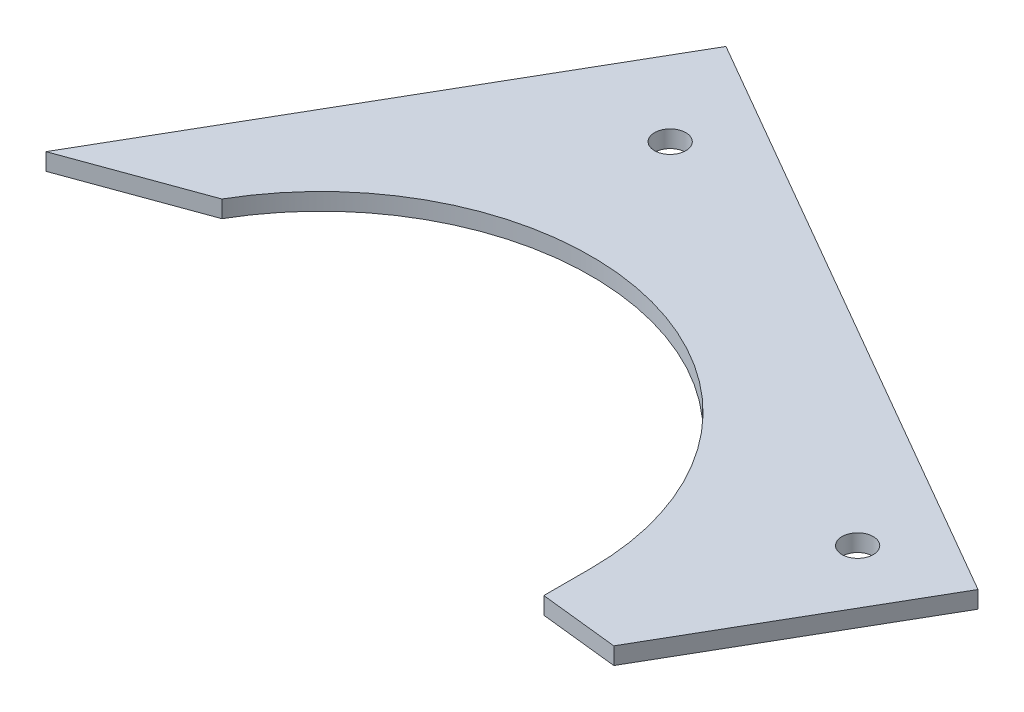
ISO-10303-21;
HEADER;
FILE_DESCRIPTION(('STEP AP214'),'2;1');
FILE_NAME('part.step','',(''),(''),'','','');
FILE_SCHEMA(('AUTOMOTIVE_DESIGN { 1 0 10303 214 1 1 1 1 }'));
ENDSEC;
DATA;
#1=APPLICATION_CONTEXT('core data for automotive mechanical design processes');
#2=APPLICATION_PROTOCOL_DEFINITION('international standard','automotive_design',2000,#1);
#3=PRODUCT_CONTEXT('',#1,'mechanical');
#4=PRODUCT('Part','Part','',(#3));
#5=PRODUCT_RELATED_PRODUCT_CATEGORY('part','',(#4));
#6=PRODUCT_DEFINITION_FORMATION('','',#4);
#7=PRODUCT_DEFINITION_CONTEXT('part definition',#1,'design');
#8=PRODUCT_DEFINITION('design','',#6,#7);
#9=PRODUCT_DEFINITION_SHAPE('','',#8);
#10=(LENGTH_UNIT() NAMED_UNIT(*) SI_UNIT(.MILLI.,.METRE.));
#11=(NAMED_UNIT(*) PLANE_ANGLE_UNIT() SI_UNIT($,.RADIAN.));
#12=(NAMED_UNIT(*) SI_UNIT($,.STERADIAN.) SOLID_ANGLE_UNIT());
#13=UNCERTAINTY_MEASURE_WITH_UNIT(LENGTH_MEASURE(1.E-05),#10,'distance_accuracy_value','');
#14=(GEOMETRIC_REPRESENTATION_CONTEXT(3) GLOBAL_UNCERTAINTY_ASSIGNED_CONTEXT((#13)) GLOBAL_UNIT_ASSIGNED_CONTEXT((#10,
#11,#12)) REPRESENTATION_CONTEXT('',''));
#15=CARTESIAN_POINT('',(0.,0.,0.));
#16=DIRECTION('',(0.,0.,1.));
#17=DIRECTION('',(1.,0.,0.));
#18=AXIS2_PLACEMENT_3D('',#15,#16,#17);
#19=CARTESIAN_POINT('',(-75.0000011175871,2.5,0.));
#20=DIRECTION('',(0.,1.,0.));
#21=DIRECTION('',(0.,0.,1.));
#22=AXIS2_PLACEMENT_3D('',#19,#20,#21);
#23=PLANE('',#22);
#24=CARTESIAN_POINT('',(-85.4711431702986,2.5,-71.863448015713));
#25=DIRECTION('',(0.,1.,0.));
#26=DIRECTION('',(0.,0.,1.));
#27=AXIS2_PLACEMENT_3D('',#24,#25,#26);
#28=CIRCLE('',#27,2.74999999999994);
#29=CARTESIAN_POINT('',(-85.4711431702986,2.5,-69.113448015713));
#30=VERTEX_POINT('',#29);
#31=EDGE_CURVE('E127',#30,#30,#28,.T.);
#32=ORIENTED_EDGE('',*,*,#31,.F.);
#33=EDGE_LOOP('',(#32));
#34=FACE_BOUND('',#33,.T.);
#35=DIRECTION('',(0.994060876940802,0.,0.108825424123615));
#36=VECTOR('',#35,1.);
#37=CARTESIAN_POINT('',(-27.5000011175871,2.5,8.31100029147373));
#38=LINE('',#37,#36);
#39=CARTESIAN_POINT('',(-27.5000011175871,2.5,8.31100029147373));
#40=VERTEX_POINT('',#39);
#41=CARTESIAN_POINT('',(-13.6980844911307,2.5,9.82197357835657));
#42=VERTEX_POINT('',#41);
#43=EDGE_CURVE('E136',#40,#42,#38,.T.);
#44=ORIENTED_EDGE('',*,*,#43,.T.);
#45=DIRECTION('',(0.5,0.,-0.866025403784439));
#46=VECTOR('',#45,1.);
#47=CARTESIAN_POINT('',(-13.6980844911307,2.5,9.82197357835657));
#48=LINE('',#47,#46);
#49=CARTESIAN_POINT('',(9.7294759487304,2.5,-30.7557514008736));
#50=VERTEX_POINT('',#49);
#51=EDGE_CURVE('E89',#42,#50,#48,.T.);
#52=ORIENTED_EDGE('',*,*,#51,.T.);
#53=DIRECTION('',(-0.866025403784439,0.,-0.5));
#54=VECTOR('',#53,1.);
#55=CARTESIAN_POINT('',(9.7294759487304,2.5,-30.7557514008736));
#56=LINE('',#55,#54);
#57=CARTESIAN_POINT('',(-95.0596007548729,2.5,-91.2557530438312));
#58=VERTEX_POINT('',#57);
#59=EDGE_CURVE('E148',#50,#58,#56,.T.);
#60=ORIENTED_EDGE('',*,*,#59,.T.);
#61=DIRECTION('',(-0.500000007561395,0.,0.866025399418865));
#62=VECTOR('',#61,1.);
#63=CARTESIAN_POINT('',(-138.795691763255,2.5,-15.5026228203214));
#64=LINE('',#63,#62);
#65=CARTESIAN_POINT('',(-138.795691763255,2.5,-15.5026228203214));
#66=VERTEX_POINT('',#65);
#67=EDGE_CURVE('E105',#58,#66,#64,.T.);
#68=ORIENTED_EDGE('',*,*,#67,.T.);
#69=DIRECTION('',(0.939692623772137,0.,-0.342020135121072));
#70=VECTOR('',#69,1.);
#71=CARTESIAN_POINT('',(-138.795691763255,2.5,-15.5026228203214));
#72=LINE('',#71,#70);
#73=CARTESIAN_POINT('',(-116.136207589983,2.5,-23.750000359166));
#74=VERTEX_POINT('',#73);
#75=EDGE_CURVE('E99',#66,#74,#72,.T.);
#76=ORIENTED_EDGE('',*,*,#75,.T.);
#77=CARTESIAN_POINT('',(-75.0000011175871,2.5,0.));
#78=DIRECTION('',(0.,-1.,0.));
#79=DIRECTION('',(0.,0.,1.));
#80=AXIS2_PLACEMENT_3D('',#77,#78,#79);
#81=CIRCLE('',#80,47.5);
#82=CARTESIAN_POINT('',(-27.5000011175871,2.5,0.));
#83=VERTEX_POINT('',#82);
#84=EDGE_CURVE('E103',#74,#83,#81,.T.);
#85=ORIENTED_EDGE('',*,*,#84,.T.);
#86=DIRECTION('',(0.,0.,1.));
#87=VECTOR('',#86,1.);
#88=CARTESIAN_POINT('',(-27.5000011175871,2.5,8.31100029147373));
#89=LINE('',#88,#87);
#90=EDGE_CURVE('E49',#83,#40,#89,.T.);
#91=ORIENTED_EDGE('',*,*,#90,.T.);
#92=EDGE_LOOP('',(#44,#52,#60,#68,#76,#85,#91));
#93=FACE_BOUND('',#92,.T.);
#94=CARTESIAN_POINT('',(-7.52885682969917,2.5,-26.863448015713));
#95=DIRECTION('',(0.,1.,0.));
#96=DIRECTION('',(0.,0.,1.));
#97=AXIS2_PLACEMENT_3D('',#94,#95,#96);
#98=CIRCLE('',#97,2.75000000000001);
#99=CARTESIAN_POINT('',(-7.52885682969917,2.5,-24.113448015713));
#100=VERTEX_POINT('',#99);
#101=EDGE_CURVE('E163',#100,#100,#98,.T.);
#102=ORIENTED_EDGE('',*,*,#101,.F.);
#103=EDGE_LOOP('',(#102));
#104=FACE_BOUND('',#103,.T.);
#105=ADVANCED_FACE('F32',(#34,#93,#104),#23,.T.);
#106=CARTESIAN_POINT('',(-75.0000011175871,-0.5,0.));
#107=DIRECTION('',(0.,1.,0.));
#108=DIRECTION('',(0.,0.,1.));
#109=AXIS2_PLACEMENT_3D('',#106,#107,#108);
#110=PLANE('',#109);
#111=DIRECTION('',(0.994060876940802,0.,0.108825424123615));
#112=VECTOR('',#111,1.);
#113=CARTESIAN_POINT('',(-27.5000011175871,-0.5,8.31100029147373));
#114=LINE('',#113,#112);
#115=CARTESIAN_POINT('',(-27.5000011175871,-0.5,8.31100029147373));
#116=VERTEX_POINT('',#115);
#117=CARTESIAN_POINT('',(-13.6980844911307,-0.5,9.82197357835657));
#118=VERTEX_POINT('',#117);
#119=EDGE_CURVE('E123',#116,#118,#114,.T.);
#120=ORIENTED_EDGE('',*,*,#119,.F.);
#121=DIRECTION('',(0.,0.,1.));
#122=VECTOR('',#121,1.);
#123=CARTESIAN_POINT('',(-27.5000011175871,-0.5,8.31100029147373));
#124=LINE('',#123,#122);
#125=CARTESIAN_POINT('',(-27.5000011175871,-0.5,0.));
#126=VERTEX_POINT('',#125);
#127=EDGE_CURVE('E81',#126,#116,#124,.T.);
#128=ORIENTED_EDGE('',*,*,#127,.F.);
#129=CARTESIAN_POINT('',(-75.0000011175871,-0.5,0.));
#130=DIRECTION('',(0.,-1.,0.));
#131=DIRECTION('',(0.,0.,1.));
#132=AXIS2_PLACEMENT_3D('',#129,#130,#131);
#133=CIRCLE('',#132,47.5);
#134=CARTESIAN_POINT('',(-116.136207589983,-0.5,-23.750000359166));
#135=VERTEX_POINT('',#134);
#136=EDGE_CURVE('E75',#135,#126,#133,.T.);
#137=ORIENTED_EDGE('',*,*,#136,.F.);
#138=DIRECTION('',(0.939692623772137,0.,-0.342020135121072));
#139=VECTOR('',#138,1.);
#140=CARTESIAN_POINT('',(-138.795691763255,-0.5,-15.5026228203214));
#141=LINE('',#140,#139);
#142=CARTESIAN_POINT('',(-138.795691763255,-0.5,-15.5026228203214));
#143=VERTEX_POINT('',#142);
#144=EDGE_CURVE('E113',#143,#135,#141,.T.);
#145=ORIENTED_EDGE('',*,*,#144,.F.);
#146=DIRECTION('',(-0.500000007561395,0.,0.866025399418865));
#147=VECTOR('',#146,1.);
#148=CARTESIAN_POINT('',(-138.795691763255,-0.5,-15.5026228203214));
#149=LINE('',#148,#147);
#150=CARTESIAN_POINT('',(-95.0596007548729,-0.5,-91.2557530438312));
#151=VERTEX_POINT('',#150);
#152=EDGE_CURVE('E131',#151,#143,#149,.T.);
#153=ORIENTED_EDGE('',*,*,#152,.F.);
#154=DIRECTION('',(-0.866025403784439,0.,-0.5));
#155=VECTOR('',#154,1.);
#156=CARTESIAN_POINT('',(9.7294759487304,-0.5,-30.7557514008736));
#157=LINE('',#156,#155);
#158=CARTESIAN_POINT('',(9.7294759487304,-0.5,-30.7557514008736));
#159=VERTEX_POINT('',#158);
#160=EDGE_CURVE('E129',#159,#151,#157,.T.);
#161=ORIENTED_EDGE('',*,*,#160,.F.);
#162=DIRECTION('',(0.5,0.,-0.866025403784439));
#163=VECTOR('',#162,1.);
#164=CARTESIAN_POINT('',(-13.6980844911307,-0.5,9.82197357835657));
#165=LINE('',#164,#163);
#166=EDGE_CURVE('E126',#118,#159,#165,.T.);
#167=ORIENTED_EDGE('',*,*,#166,.F.);
#168=EDGE_LOOP('',(#120,#128,#137,#145,#153,#161,#167));
#169=FACE_BOUND('',#168,.T.);
#170=CARTESIAN_POINT('',(-85.4711431702986,-0.5,-71.863448015713));
#171=DIRECTION('',(0.,1.,0.));
#172=DIRECTION('',(0.,0.,1.));
#173=AXIS2_PLACEMENT_3D('',#170,#171,#172);
#174=CIRCLE('',#173,2.74999999999994);
#175=CARTESIAN_POINT('',(-85.4711431702986,-0.5,-69.113448015713));
#176=VERTEX_POINT('',#175);
#177=EDGE_CURVE('E160',#176,#176,#174,.T.);
#178=ORIENTED_EDGE('',*,*,#177,.T.);
#179=EDGE_LOOP('',(#178));
#180=FACE_BOUND('',#179,.T.);
#181=CARTESIAN_POINT('',(-7.52885682969917,-0.5,-26.863448015713));
#182=DIRECTION('',(0.,1.,0.));
#183=DIRECTION('',(0.,0.,1.));
#184=AXIS2_PLACEMENT_3D('',#181,#182,#183);
#185=CIRCLE('',#184,2.75000000000001);
#186=CARTESIAN_POINT('',(-7.52885682969917,-0.5,-24.113448015713));
#187=VERTEX_POINT('',#186);
#188=EDGE_CURVE('E166',#187,#187,#185,.T.);
#189=ORIENTED_EDGE('',*,*,#188,.T.);
#190=EDGE_LOOP('',(#189));
#191=FACE_BOUND('',#190,.T.);
#192=ADVANCED_FACE('F152',(#169,#180,#191),#110,.F.);
#193=CARTESIAN_POINT('',(-27.5000011175871,2.5,8.31100029147373));
#194=DIRECTION('',(0.108825424123615,0.,-0.994060876940801));
#195=DIRECTION('',(-0.994060876940802,0.,-0.108825424123615));
#196=AXIS2_PLACEMENT_3D('',#193,#194,#195);
#197=PLANE('',#196);
#198=ORIENTED_EDGE('',*,*,#119,.T.);
#199=DIRECTION('',(0.,-1.,0.));
#200=VECTOR('',#199,1.);
#201=CARTESIAN_POINT('',(-13.6980844911307,2.5,9.82197357835657));
#202=LINE('',#201,#200);
#203=EDGE_CURVE('E11',#42,#118,#202,.T.);
#204=ORIENTED_EDGE('',*,*,#203,.F.);
#205=ORIENTED_EDGE('',*,*,#43,.F.);
#206=DIRECTION('',(0.,-1.,0.));
#207=VECTOR('',#206,1.);
#208=CARTESIAN_POINT('',(-27.5000011175871,2.5,8.31100029147373));
#209=LINE('',#208,#207);
#210=EDGE_CURVE('E119',#40,#116,#209,.T.);
#211=ORIENTED_EDGE('',*,*,#210,.T.);
#212=EDGE_LOOP('',(#198,#204,#205,#211));
#213=FACE_BOUND('',#212,.T.);
#214=ADVANCED_FACE('F34',(#213),#197,.F.);
#215=CARTESIAN_POINT('',(-13.6980844911307,2.5,9.82197357835657));
#216=DIRECTION('',(-0.866025403784439,0.,-0.5));
#217=DIRECTION('',(-0.5,0.,0.866025403784439));
#218=AXIS2_PLACEMENT_3D('',#215,#216,#217);
#219=PLANE('',#218);
#220=ORIENTED_EDGE('',*,*,#166,.T.);
#221=DIRECTION('',(0.,-1.,0.));
#222=VECTOR('',#221,1.);
#223=CARTESIAN_POINT('',(9.7294759487304,2.5,-30.7557514008736));
#224=LINE('',#223,#222);
#225=EDGE_CURVE('E41',#50,#159,#224,.T.);
#226=ORIENTED_EDGE('',*,*,#225,.F.);
#227=ORIENTED_EDGE('',*,*,#51,.F.);
#228=ORIENTED_EDGE('',*,*,#203,.T.);
#229=EDGE_LOOP('',(#220,#226,#227,#228));
#230=FACE_BOUND('',#229,.T.);
#231=ADVANCED_FACE('F196',(#230),#219,.F.);
#232=CARTESIAN_POINT('',(9.7294759487304,2.5,-30.7557514008736));
#233=DIRECTION('',(-0.5,0.,0.866025403784439));
#234=DIRECTION('',(0.866025403784439,0.,0.5));
#235=AXIS2_PLACEMENT_3D('',#232,#233,#234);
#236=PLANE('',#235);
#237=ORIENTED_EDGE('',*,*,#160,.T.);
#238=DIRECTION('',(0.,-1.,0.));
#239=VECTOR('',#238,1.);
#240=CARTESIAN_POINT('',(-95.0596007548729,2.5,-91.2557530438312));
#241=LINE('',#240,#239);
#242=EDGE_CURVE('E140',#58,#151,#241,.T.);
#243=ORIENTED_EDGE('',*,*,#242,.F.);
#244=ORIENTED_EDGE('',*,*,#59,.F.);
#245=ORIENTED_EDGE('',*,*,#225,.T.);
#246=EDGE_LOOP('',(#237,#243,#244,#245));
#247=FACE_BOUND('',#246,.T.);
#248=ADVANCED_FACE('F146',(#247),#236,.F.);
#249=CARTESIAN_POINT('',(-138.795691763255,2.5,-15.5026228203214));
#250=DIRECTION('',(0.866025399418865,0.,0.500000007561395));
#251=DIRECTION('',(0.500000007561395,0.,-0.866025399418865));
#252=AXIS2_PLACEMENT_3D('',#249,#250,#251);
#253=PLANE('',#252);
#254=ORIENTED_EDGE('',*,*,#152,.T.);
#255=DIRECTION('',(0.,-1.,0.));
#256=VECTOR('',#255,1.);
#257=CARTESIAN_POINT('',(-138.795691763255,2.5,-15.5026228203214));
#258=LINE('',#257,#256);
#259=EDGE_CURVE('E114',#66,#143,#258,.T.);
#260=ORIENTED_EDGE('',*,*,#259,.F.);
#261=ORIENTED_EDGE('',*,*,#67,.F.);
#262=ORIENTED_EDGE('',*,*,#242,.T.);
#263=EDGE_LOOP('',(#254,#260,#261,#262));
#264=FACE_BOUND('',#263,.T.);
#265=ADVANCED_FACE('F155',(#264),#253,.F.);
#266=CARTESIAN_POINT('',(-138.795691763255,2.5,-15.5026228203214));
#267=DIRECTION('',(-0.342020135121073,0.,-0.939692623772137));
#268=DIRECTION('',(-0.939692623772137,0.,0.342020135121073));
#269=AXIS2_PLACEMENT_3D('',#266,#267,#268);
#270=PLANE('',#269);
#271=ORIENTED_EDGE('',*,*,#144,.T.);
#272=DIRECTION('',(0.,-1.,0.));
#273=VECTOR('',#272,1.);
#274=CARTESIAN_POINT('',(-116.136207589983,2.5,-23.750000359166));
#275=LINE('',#274,#273);
#276=EDGE_CURVE('E110',#74,#135,#275,.T.);
#277=ORIENTED_EDGE('',*,*,#276,.F.);
#278=ORIENTED_EDGE('',*,*,#75,.F.);
#279=ORIENTED_EDGE('',*,*,#259,.T.);
#280=EDGE_LOOP('',(#271,#277,#278,#279));
#281=FACE_BOUND('',#280,.T.);
#282=ADVANCED_FACE('F111',(#281),#270,.F.);
#283=CARTESIAN_POINT('',(-75.0000011175871,2.5,0.));
#284=DIRECTION('',(0.,-1.,0.));
#285=DIRECTION('',(0.,0.,-1.));
#286=AXIS2_PLACEMENT_3D('',#283,#284,#285);
#287=CYLINDRICAL_SURFACE('',#286,47.5);
#288=ORIENTED_EDGE('',*,*,#136,.T.);
#289=DIRECTION('',(0.,-1.,0.));
#290=VECTOR('',#289,1.);
#291=CARTESIAN_POINT('',(-27.5000011175871,2.5,0.));
#292=LINE('',#291,#290);
#293=EDGE_CURVE('E115',#83,#126,#292,.T.);
#294=ORIENTED_EDGE('',*,*,#293,.F.);
#295=ORIENTED_EDGE('',*,*,#84,.F.);
#296=ORIENTED_EDGE('',*,*,#276,.T.);
#297=EDGE_LOOP('',(#288,#294,#295,#296));
#298=FACE_BOUND('',#297,.T.);
#299=ADVANCED_FACE('F117',(#298),#287,.F.);
#300=CARTESIAN_POINT('',(-27.5000011175871,2.5,8.31100029147373));
#301=DIRECTION('',(1.,0.,0.));
#302=DIRECTION('',(0.,0.,-1.));
#303=AXIS2_PLACEMENT_3D('',#300,#301,#302);
#304=PLANE('',#303);
#305=ORIENTED_EDGE('',*,*,#127,.T.);
#306=ORIENTED_EDGE('',*,*,#210,.F.);
#307=ORIENTED_EDGE('',*,*,#90,.F.);
#308=ORIENTED_EDGE('',*,*,#293,.T.);
#309=EDGE_LOOP('',(#305,#306,#307,#308));
#310=FACE_BOUND('',#309,.T.);
#311=ADVANCED_FACE('F186',(#310),#304,.F.);
#312=CARTESIAN_POINT('',(-85.4711431702986,2.5,-71.863448015713));
#313=DIRECTION('',(0.,-1.,0.));
#314=DIRECTION('',(0.,0.,-1.));
#315=AXIS2_PLACEMENT_3D('',#312,#313,#314);
#316=CYLINDRICAL_SURFACE('',#315,2.74999999999994);
#317=ORIENTED_EDGE('',*,*,#31,.T.);
#318=EDGE_LOOP('',(#317));
#319=FACE_BOUND('',#318,.T.);
#320=ORIENTED_EDGE('',*,*,#177,.F.);
#321=EDGE_LOOP('',(#320));
#322=FACE_BOUND('',#321,.T.);
#323=ADVANCED_FACE('F183',(#319,#322),#316,.F.);
#324=CARTESIAN_POINT('',(-7.52885682969917,2.5,-26.863448015713));
#325=DIRECTION('',(0.,-1.,0.));
#326=DIRECTION('',(0.,0.,-1.));
#327=AXIS2_PLACEMENT_3D('',#324,#325,#326);
#328=CYLINDRICAL_SURFACE('',#327,2.75000000000001);
#329=ORIENTED_EDGE('',*,*,#101,.T.);
#330=EDGE_LOOP('',(#329));
#331=FACE_BOUND('',#330,.T.);
#332=ORIENTED_EDGE('',*,*,#188,.F.);
#333=EDGE_LOOP('',(#332));
#334=FACE_BOUND('',#333,.T.);
#335=ADVANCED_FACE('F172',(#331,#334),#328,.F.);
#336=CLOSED_SHELL('',(#105,#192,#214,#231,#248,#265,#282,#299,#311,#323,#335));
#337=MANIFOLD_SOLID_BREP('B2',#336);
#338=ADVANCED_BREP_SHAPE_REPRESENTATION('',(#18,#337),#14);
#339=SHAPE_DEFINITION_REPRESENTATION(#9,#338);
ENDSEC;
END-ISO-10303-21;
